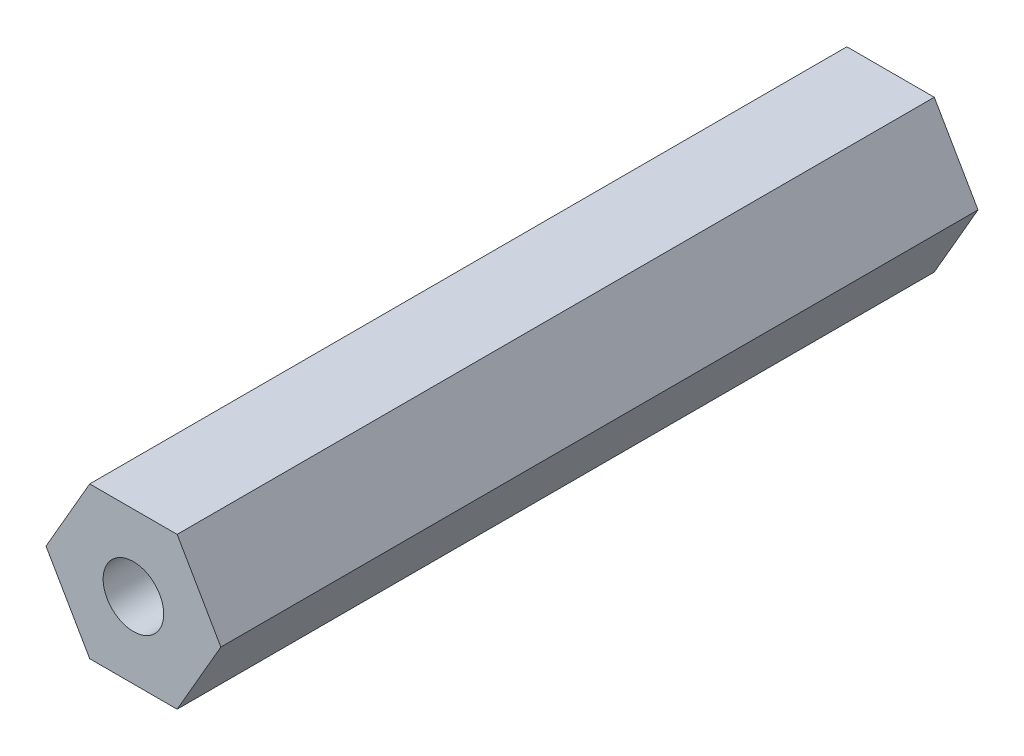
ISO-10303-21;
HEADER;
FILE_DESCRIPTION(('STEP AP214'),'2;1');
FILE_NAME('part.step','',(''),(''),'','','');
FILE_SCHEMA(('AUTOMOTIVE_DESIGN { 1 0 10303 214 1 1 1 1 }'));
ENDSEC;
DATA;
#1=APPLICATION_CONTEXT('core data for automotive mechanical design processes');
#2=APPLICATION_PROTOCOL_DEFINITION('international standard','automotive_design',2000,#1);
#3=PRODUCT_CONTEXT('',#1,'mechanical');
#4=PRODUCT('Part','Part','',(#3));
#5=PRODUCT_RELATED_PRODUCT_CATEGORY('part','',(#4));
#6=PRODUCT_DEFINITION_FORMATION('','',#4);
#7=PRODUCT_DEFINITION_CONTEXT('part definition',#1,'design');
#8=PRODUCT_DEFINITION('design','',#6,#7);
#9=PRODUCT_DEFINITION_SHAPE('','',#8);
#10=(LENGTH_UNIT() NAMED_UNIT(*) SI_UNIT(.MILLI.,.METRE.));
#11=(NAMED_UNIT(*) PLANE_ANGLE_UNIT() SI_UNIT($,.RADIAN.));
#12=(NAMED_UNIT(*) SI_UNIT($,.STERADIAN.) SOLID_ANGLE_UNIT());
#13=UNCERTAINTY_MEASURE_WITH_UNIT(LENGTH_MEASURE(1.E-05),#10,'distance_accuracy_value','');
#14=(GEOMETRIC_REPRESENTATION_CONTEXT(3) GLOBAL_UNCERTAINTY_ASSIGNED_CONTEXT((#13)) GLOBAL_UNIT_ASSIGNED_CONTEXT((#10,
#11,#12)) REPRESENTATION_CONTEXT('',''));
#15=CARTESIAN_POINT('',(0.,0.,0.));
#16=DIRECTION('',(0.,0.,1.));
#17=DIRECTION('',(1.,0.,0.));
#18=AXIS2_PLACEMENT_3D('',#15,#16,#17);
#19=CARTESIAN_POINT('',(1.44337567297409,-2.49999999999997,25.));
#20=DIRECTION('',(-0.866025403784442,0.499999999999995,0.));
#21=DIRECTION('',(-0.499999999999995,-0.866025403784442,0.));
#22=AXIS2_PLACEMENT_3D('',#19,#20,#21);
#23=PLANE('',#22);
#24=DIRECTION('',(0.499999999999995,0.866025403784442,0.));
#25=VECTOR('',#24,1.);
#26=CARTESIAN_POINT('',(1.44337567297409,-2.49999999999997,0.));
#27=LINE('',#26,#25);
#28=CARTESIAN_POINT('',(1.44337567297409,-2.49999999999997,0.));
#29=VERTEX_POINT('',#28);
#30=CARTESIAN_POINT('',(2.88675134594812,0.,0.));
#31=VERTEX_POINT('',#30);
#32=EDGE_CURVE('E128',#29,#31,#27,.T.);
#33=ORIENTED_EDGE('',*,*,#32,.T.);
#34=DIRECTION('',(0.,0.,-1.));
#35=VECTOR('',#34,1.);
#36=CARTESIAN_POINT('',(2.88675134594812,0.,25.));
#37=LINE('',#36,#35);
#38=CARTESIAN_POINT('',(2.88675134594812,0.,25.));
#39=VERTEX_POINT('',#38);
#40=EDGE_CURVE('E11',#39,#31,#37,.T.);
#41=ORIENTED_EDGE('',*,*,#40,.F.);
#42=DIRECTION('',(0.499999999999995,0.866025403784442,0.));
#43=VECTOR('',#42,1.);
#44=CARTESIAN_POINT('',(1.44337567297409,-2.49999999999997,25.));
#45=LINE('',#44,#43);
#46=CARTESIAN_POINT('',(1.44337567297409,-2.49999999999997,25.));
#47=VERTEX_POINT('',#46);
#48=EDGE_CURVE('E145',#47,#39,#45,.T.);
#49=ORIENTED_EDGE('',*,*,#48,.F.);
#50=DIRECTION('',(0.,0.,-1.));
#51=VECTOR('',#50,1.);
#52=CARTESIAN_POINT('',(1.44337567297409,-2.49999999999997,25.));
#53=LINE('',#52,#51);
#54=EDGE_CURVE('E124',#47,#29,#53,.T.);
#55=ORIENTED_EDGE('',*,*,#54,.T.);
#56=EDGE_LOOP('',(#33,#41,#49,#55));
#57=FACE_BOUND('',#56,.T.);
#58=ADVANCED_FACE('F39',(#57),#23,.F.);
#59=CARTESIAN_POINT('',(2.88675134594812,0.,25.));
#60=DIRECTION('',(-0.866025403784438,-0.500000000000001,0.));
#61=DIRECTION('',(0.500000000000001,-0.866025403784438,0.));
#62=AXIS2_PLACEMENT_3D('',#59,#60,#61);
#63=PLANE('',#62);
#64=DIRECTION('',(-0.500000000000001,0.866025403784438,0.));
#65=VECTOR('',#64,1.);
#66=CARTESIAN_POINT('',(2.88675134594812,0.,0.));
#67=LINE('',#66,#65);
#68=CARTESIAN_POINT('',(1.44337567297405,2.49999999999999,0.));
#69=VERTEX_POINT('',#68);
#70=EDGE_CURVE('E132',#31,#69,#67,.T.);
#71=ORIENTED_EDGE('',*,*,#70,.T.);
#72=DIRECTION('',(0.,0.,-1.));
#73=VECTOR('',#72,1.);
#74=CARTESIAN_POINT('',(1.44337567297405,2.49999999999999,25.));
#75=LINE('',#74,#73);
#76=CARTESIAN_POINT('',(1.44337567297405,2.49999999999999,25.));
#77=VERTEX_POINT('',#76);
#78=EDGE_CURVE('E48',#77,#69,#75,.T.);
#79=ORIENTED_EDGE('',*,*,#78,.F.);
#80=DIRECTION('',(-0.500000000000001,0.866025403784438,0.));
#81=VECTOR('',#80,1.);
#82=CARTESIAN_POINT('',(2.88675134594812,0.,25.));
#83=LINE('',#82,#81);
#84=EDGE_CURVE('E93',#39,#77,#83,.T.);
#85=ORIENTED_EDGE('',*,*,#84,.F.);
#86=ORIENTED_EDGE('',*,*,#40,.T.);
#87=EDGE_LOOP('',(#71,#79,#85,#86));
#88=FACE_BOUND('',#87,.T.);
#89=ADVANCED_FACE('F174',(#88),#63,.F.);
#90=CARTESIAN_POINT('',(1.44337567297405,2.49999999999999,25.));
#91=DIRECTION('',(0.,-1.,0.));
#92=DIRECTION('',(1.,0.,0.));
#93=AXIS2_PLACEMENT_3D('',#90,#91,#92);
#94=PLANE('',#93);
#95=DIRECTION('',(-1.,0.,0.));
#96=VECTOR('',#95,1.);
#97=CARTESIAN_POINT('',(1.44337567297405,2.49999999999999,0.));
#98=LINE('',#97,#96);
#99=CARTESIAN_POINT('',(-1.44337567297407,2.49999999999998,0.));
#100=VERTEX_POINT('',#99);
#101=EDGE_CURVE('E136',#69,#100,#98,.T.);
#102=ORIENTED_EDGE('',*,*,#101,.T.);
#103=DIRECTION('',(0.,0.,-1.));
#104=VECTOR('',#103,1.);
#105=CARTESIAN_POINT('',(-1.44337567297407,2.49999999999998,25.));
#106=LINE('',#105,#104);
#107=CARTESIAN_POINT('',(-1.44337567297407,2.49999999999998,25.));
#108=VERTEX_POINT('',#107);
#109=EDGE_CURVE('E117',#108,#100,#106,.T.);
#110=ORIENTED_EDGE('',*,*,#109,.F.);
#111=DIRECTION('',(-1.,0.,0.));
#112=VECTOR('',#111,1.);
#113=CARTESIAN_POINT('',(1.44337567297405,2.49999999999999,25.));
#114=LINE('',#113,#112);
#115=EDGE_CURVE('E106',#77,#108,#114,.T.);
#116=ORIENTED_EDGE('',*,*,#115,.F.);
#117=ORIENTED_EDGE('',*,*,#78,.T.);
#118=EDGE_LOOP('',(#102,#110,#116,#117));
#119=FACE_BOUND('',#118,.T.);
#120=ADVANCED_FACE('F155',(#119),#94,.F.);
#121=CARTESIAN_POINT('',(-1.44337567297407,2.49999999999998,25.));
#122=DIRECTION('',(0.866025403784441,-0.499999999999995,0.));
#123=DIRECTION('',(0.499999999999995,0.866025403784441,0.));
#124=AXIS2_PLACEMENT_3D('',#121,#122,#123);
#125=PLANE('',#124);
#126=DIRECTION('',(-0.499999999999995,-0.866025403784441,0.));
#127=VECTOR('',#126,1.);
#128=CARTESIAN_POINT('',(-1.44337567297407,2.49999999999998,0.));
#129=LINE('',#128,#127);
#130=CARTESIAN_POINT('',(-2.88675134594812,0.,0.));
#131=VERTEX_POINT('',#130);
#132=EDGE_CURVE('E115',#100,#131,#129,.T.);
#133=ORIENTED_EDGE('',*,*,#132,.T.);
#134=DIRECTION('',(0.,0.,-1.));
#135=VECTOR('',#134,1.);
#136=CARTESIAN_POINT('',(-2.88675134594812,0.,25.));
#137=LINE('',#136,#135);
#138=CARTESIAN_POINT('',(-2.88675134594812,0.,25.));
#139=VERTEX_POINT('',#138);
#140=EDGE_CURVE('E112',#139,#131,#137,.T.);
#141=ORIENTED_EDGE('',*,*,#140,.F.);
#142=DIRECTION('',(-0.499999999999995,-0.866025403784441,0.));
#143=VECTOR('',#142,1.);
#144=CARTESIAN_POINT('',(-1.44337567297407,2.49999999999998,25.));
#145=LINE('',#144,#143);
#146=EDGE_CURVE('E100',#108,#139,#145,.T.);
#147=ORIENTED_EDGE('',*,*,#146,.F.);
#148=ORIENTED_EDGE('',*,*,#109,.T.);
#149=EDGE_LOOP('',(#133,#141,#147,#148));
#150=FACE_BOUND('',#149,.T.);
#151=ADVANCED_FACE('F113',(#150),#125,.F.);
#152=CARTESIAN_POINT('',(-2.88675134594812,0.,25.));
#153=DIRECTION('',(0.866025403784435,0.500000000000007,0.));
#154=DIRECTION('',(-0.500000000000007,0.866025403784435,0.));
#155=AXIS2_PLACEMENT_3D('',#152,#153,#154);
#156=PLANE('',#155);
#157=DIRECTION('',(0.500000000000007,-0.866025403784435,0.));
#158=VECTOR('',#157,1.);
#159=CARTESIAN_POINT('',(-2.88675134594812,0.,0.));
#160=LINE('',#159,#158);
#161=CARTESIAN_POINT('',(-1.44337567297404,-2.5,0.));
#162=VERTEX_POINT('',#161);
#163=EDGE_CURVE('E79',#131,#162,#160,.T.);
#164=ORIENTED_EDGE('',*,*,#163,.T.);
#165=DIRECTION('',(0.,0.,-1.));
#166=VECTOR('',#165,1.);
#167=CARTESIAN_POINT('',(-1.44337567297404,-2.5,25.));
#168=LINE('',#167,#166);
#169=CARTESIAN_POINT('',(-1.44337567297404,-2.5,25.));
#170=VERTEX_POINT('',#169);
#171=EDGE_CURVE('E118',#170,#162,#168,.T.);
#172=ORIENTED_EDGE('',*,*,#171,.F.);
#173=DIRECTION('',(0.500000000000007,-0.866025403784435,0.));
#174=VECTOR('',#173,1.);
#175=CARTESIAN_POINT('',(-2.88675134594812,0.,25.));
#176=LINE('',#175,#174);
#177=EDGE_CURVE('E104',#139,#170,#176,.T.);
#178=ORIENTED_EDGE('',*,*,#177,.F.);
#179=ORIENTED_EDGE('',*,*,#140,.T.);
#180=EDGE_LOOP('',(#164,#172,#178,#179));
#181=FACE_BOUND('',#180,.T.);
#182=ADVANCED_FACE('F120',(#181),#156,.F.);
#183=CARTESIAN_POINT('',(-1.44337567297404,-2.5,25.));
#184=DIRECTION('',(0.,1.,0.));
#185=DIRECTION('',(-1.,0.,0.));
#186=AXIS2_PLACEMENT_3D('',#183,#184,#185);
#187=PLANE('',#186);
#188=DIRECTION('',(1.,0.,0.));
#189=VECTOR('',#188,1.);
#190=CARTESIAN_POINT('',(-1.44337567297404,-2.5,0.));
#191=LINE('',#190,#189);
#192=EDGE_CURVE('E85',#162,#29,#191,.T.);
#193=ORIENTED_EDGE('',*,*,#192,.T.);
#194=ORIENTED_EDGE('',*,*,#54,.F.);
#195=DIRECTION('',(1.,0.,0.));
#196=VECTOR('',#195,1.);
#197=CARTESIAN_POINT('',(-1.44337567297404,-2.5,25.));
#198=LINE('',#197,#196);
#199=EDGE_CURVE('E56',#170,#47,#198,.T.);
#200=ORIENTED_EDGE('',*,*,#199,.F.);
#201=ORIENTED_EDGE('',*,*,#171,.T.);
#202=EDGE_LOOP('',(#193,#194,#200,#201));
#203=FACE_BOUND('',#202,.T.);
#204=ADVANCED_FACE('F162',(#203),#187,.F.);
#205=CARTESIAN_POINT('',(0.,0.,25.));
#206=DIRECTION('',(0.,0.,1.));
#207=DIRECTION('',(1.,0.,0.));
#208=AXIS2_PLACEMENT_3D('',#205,#206,#207);
#209=PLANE('',#208);
#210=CARTESIAN_POINT('',(0.,0.,25.));
#211=DIRECTION('',(0.,0.,1.));
#212=DIRECTION('',(1.,0.,0.));
#213=AXIS2_PLACEMENT_3D('',#210,#211,#212);
#214=CIRCLE('',#213,1.);
#215=CARTESIAN_POINT('',(1.,0.,25.));
#216=VERTEX_POINT('',#215);
#217=EDGE_CURVE('E229',#216,#216,#214,.T.);
#218=ORIENTED_EDGE('',*,*,#217,.F.);
#219=EDGE_LOOP('',(#218));
#220=FACE_BOUND('',#219,.T.);
#221=ORIENTED_EDGE('',*,*,#48,.T.);
#222=ORIENTED_EDGE('',*,*,#84,.T.);
#223=ORIENTED_EDGE('',*,*,#115,.T.);
#224=ORIENTED_EDGE('',*,*,#146,.T.);
#225=ORIENTED_EDGE('',*,*,#177,.T.);
#226=ORIENTED_EDGE('',*,*,#199,.T.);
#227=EDGE_LOOP('',(#221,#222,#223,#224,#225,#226));
#228=FACE_BOUND('',#227,.T.);
#229=ADVANCED_FACE('F102',(#220,#228),#209,.T.);
#230=CARTESIAN_POINT('',(0.,0.,0.));
#231=DIRECTION('',(0.,0.,1.));
#232=DIRECTION('',(1.,0.,0.));
#233=AXIS2_PLACEMENT_3D('',#230,#231,#232);
#234=PLANE('',#233);
#235=CARTESIAN_POINT('',(0.,0.,0.));
#236=DIRECTION('',(0.,0.,1.));
#237=DIRECTION('',(1.,0.,0.));
#238=AXIS2_PLACEMENT_3D('',#235,#236,#237);
#239=CIRCLE('',#238,1.);
#240=CARTESIAN_POINT('',(1.,0.,0.));
#241=VERTEX_POINT('',#240);
#242=EDGE_CURVE('E133',#241,#241,#239,.T.);
#243=ORIENTED_EDGE('',*,*,#242,.T.);
#244=EDGE_LOOP('',(#243));
#245=FACE_BOUND('',#244,.T.);
#246=ORIENTED_EDGE('',*,*,#32,.F.);
#247=ORIENTED_EDGE('',*,*,#192,.F.);
#248=ORIENTED_EDGE('',*,*,#163,.F.);
#249=ORIENTED_EDGE('',*,*,#132,.F.);
#250=ORIENTED_EDGE('',*,*,#101,.F.);
#251=ORIENTED_EDGE('',*,*,#70,.F.);
#252=EDGE_LOOP('',(#246,#247,#248,#249,#250,#251));
#253=FACE_BOUND('',#252,.T.);
#254=ADVANCED_FACE('F158',(#245,#253),#234,.F.);
#255=CARTESIAN_POINT('',(0.,0.,0.));
#256=DIRECTION('',(0.,0.,1.));
#257=DIRECTION('',(1.,0.,0.));
#258=AXIS2_PLACEMENT_3D('',#255,#256,#257);
#259=CYLINDRICAL_SURFACE('',#258,1.);
#260=ORIENTED_EDGE('',*,*,#242,.F.);
#261=EDGE_LOOP('',(#260));
#262=FACE_BOUND('',#261,.T.);
#263=ORIENTED_EDGE('',*,*,#217,.T.);
#264=EDGE_LOOP('',(#263));
#265=FACE_BOUND('',#264,.T.);
#266=ADVANCED_FACE('F211',(#262,#265),#259,.F.);
#267=CLOSED_SHELL('',(#58,#89,#120,#151,#182,#204,#229,#254,#266));
#268=MANIFOLD_SOLID_BREP('B2',#267);
#269=ADVANCED_BREP_SHAPE_REPRESENTATION('',(#18,#268),#14);
#270=SHAPE_DEFINITION_REPRESENTATION(#9,#269);
ENDSEC;
END-ISO-10303-21;
